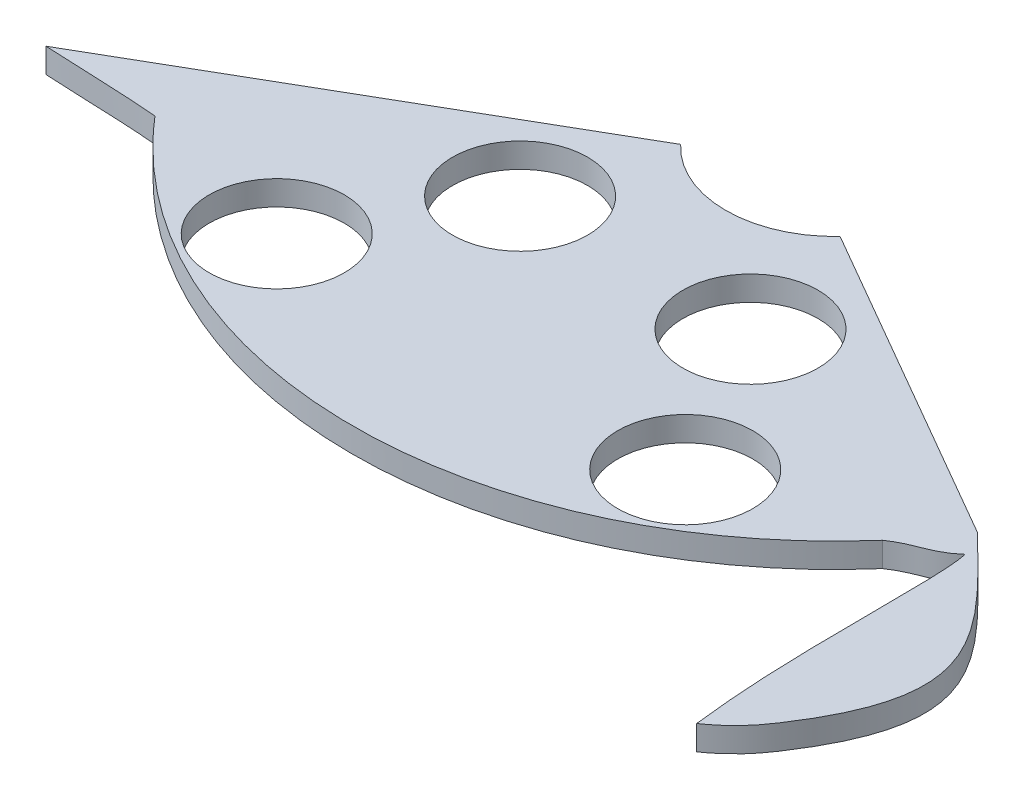
ISO-10303-21;
HEADER;
FILE_DESCRIPTION(('STEP AP214'),'2;1');
FILE_NAME('part.step','',(''),(''),'','','');
FILE_SCHEMA(('AUTOMOTIVE_DESIGN { 1 0 10303 214 1 1 1 1 }'));
ENDSEC;
DATA;
#1=APPLICATION_CONTEXT('core data for automotive mechanical design processes');
#2=APPLICATION_PROTOCOL_DEFINITION('international standard','automotive_design',2000,#1);
#3=PRODUCT_CONTEXT('',#1,'mechanical');
#4=PRODUCT('Part','Part','',(#3));
#5=PRODUCT_RELATED_PRODUCT_CATEGORY('part','',(#4));
#6=PRODUCT_DEFINITION_FORMATION('','',#4);
#7=PRODUCT_DEFINITION_CONTEXT('part definition',#1,'design');
#8=PRODUCT_DEFINITION('design','',#6,#7);
#9=PRODUCT_DEFINITION_SHAPE('','',#8);
#10=(LENGTH_UNIT() NAMED_UNIT(*) SI_UNIT(.MILLI.,.METRE.));
#11=(NAMED_UNIT(*) PLANE_ANGLE_UNIT() SI_UNIT($,.RADIAN.));
#12=(NAMED_UNIT(*) SI_UNIT($,.STERADIAN.) SOLID_ANGLE_UNIT());
#13=UNCERTAINTY_MEASURE_WITH_UNIT(LENGTH_MEASURE(1.E-05),#10,'distance_accuracy_value','');
#14=(GEOMETRIC_REPRESENTATION_CONTEXT(3) GLOBAL_UNCERTAINTY_ASSIGNED_CONTEXT((#13)) GLOBAL_UNIT_ASSIGNED_CONTEXT((#10,
#11,#12)) REPRESENTATION_CONTEXT('',''));
#15=CARTESIAN_POINT('',(0.,0.,0.));
#16=DIRECTION('',(0.,0.,1.));
#17=DIRECTION('',(1.,0.,0.));
#18=AXIS2_PLACEMENT_3D('',#15,#16,#17);
#19=CARTESIAN_POINT('',(-69.1124513875644,-23.7359999999999,50.3384617614446));
#20=DIRECTION('',(0.,-1.,0.));
#21=DIRECTION('',(0.,0.,-1.));
#22=AXIS2_PLACEMENT_3D('',#19,#20,#21);
#23=PLANE('',#22);
#24=CARTESIAN_POINT('',(18.75,-23.7359999999999,32.476));
#25=DIRECTION('',(0.,-1.,0.));
#26=DIRECTION('',(0.,0.,-1.));
#27=AXIS2_PLACEMENT_3D('',#24,#25,#26);
#28=CIRCLE('',#27,10.999845998306);
#29=CARTESIAN_POINT('',(18.75,-23.7359999999999,21.476154001694));
#30=VERTEX_POINT('',#29);
#31=EDGE_CURVE('E307',#30,#30,#28,.T.);
#32=ORIENTED_EDGE('',*,*,#31,.F.);
#33=EDGE_LOOP('',(#32));
#34=FACE_BOUND('',#33,.T.);
#35=CARTESIAN_POINT('',(-33.25,-23.7359999999999,57.591));
#36=DIRECTION('',(0.,-1.,0.));
#37=DIRECTION('',(0.,0.,-1.));
#38=AXIS2_PLACEMENT_3D('',#35,#36,#37);
#39=CIRCLE('',#38,10.999845998306);
#40=CARTESIAN_POINT('',(-33.25,-23.7359999999999,46.591154001694));
#41=VERTEX_POINT('',#40);
#42=EDGE_CURVE('E300',#41,#41,#39,.T.);
#43=ORIENTED_EDGE('',*,*,#42,.F.);
#44=EDGE_LOOP('',(#43));
#45=FACE_BOUND('',#44,.T.);
#46=DIRECTION('',(0.866023970222276,0.,-0.500002482994281));
#47=VECTOR('',#46,1.);
#48=CARTESIAN_POINT('',(-69.4473114993103,-23.7359999999999,44.7142801293079));
#49=LINE('',#48,#47);
#50=CARTESIAN_POINT('',(-78.47579260709,-23.7359999999999,49.9269106415998));
#51=VERTEX_POINT('',#50);
#52=CARTESIAN_POINT('',(-69.4473114993103,-23.7359999999999,44.7142801293079));
#53=VERTEX_POINT('',#52);
#54=EDGE_CURVE('E296',#51,#53,#49,.T.);
#55=ORIENTED_EDGE('',*,*,#54,.T.);
#56=DIRECTION('',(0.86602512227785,0.,-0.500000487583396));
#57=VECTOR('',#56,1.);
#58=CARTESIAN_POINT('',(-69.4473114993103,-23.7359999999999,44.7142801293079));
#59=LINE('',#58,#57);
#60=CARTESIAN_POINT('',(-12.9766531358799,-23.7359999999999,12.1108879302399));
#61=VERTEX_POINT('',#60);
#62=EDGE_CURVE('E103',#53,#61,#59,.T.);
#63=ORIENTED_EDGE('',*,*,#62,.T.);
#64=CARTESIAN_POINT('',(0.,-23.7359999999999,0.));
#65=DIRECTION('',(0.,1.,0.));
#66=DIRECTION('',(0.,0.,-1.));
#67=AXIS2_PLACEMENT_3D('',#64,#65,#66);
#68=CIRCLE('',#67,17.7501305084715);
#69=CARTESIAN_POINT('',(12.9766531358511,-23.7359999999999,12.1108879302707));
#70=VERTEX_POINT('',#69);
#71=EDGE_CURVE('E293',#61,#70,#68,.T.);
#72=ORIENTED_EDGE('',*,*,#71,.T.);
#73=DIRECTION('',(0.866025113442762,0.,0.500000502886197));
#74=VECTOR('',#73,1.);
#75=CARTESIAN_POINT('',(12.9766531358511,-23.7359999999999,12.1108879302707));
#76=LINE('',#75,#74);
#77=CARTESIAN_POINT('',(65.8946490574716,-23.7359999999999,42.6631480920527));
#78=VERTEX_POINT('',#77);
#79=EDGE_CURVE('E288',#70,#78,#76,.T.);
#80=ORIENTED_EDGE('',*,*,#79,.T.);
#81=CARTESIAN_POINT('',(65.8946490574716,-23.7359999999999,42.6631480920527));
#82=CARTESIAN_POINT('',(81.2383570122726,-23.7359999999999,57.6152141275644));
#83=CARTESIAN_POINT('',(89.9374263412387,-23.7359999999999,65.8113401457254));
#84=CARTESIAN_POINT('',(74.626877504248,-23.7359999999999,88.5732499283281));
#85=CARTESIAN_POINT('',(72.4788017296965,-23.7359999999999,90.705561356363));
#86=CARTESIAN_POINT('',(69.970809865271,-23.7359999999999,92.4555617462981));
#87=B_SPLINE_CURVE_WITH_KNOTS('',3,(#81,#82,#83,#84,#85,#86),.UNSPECIFIED.,.F.,.F.,(4,2,4),(0.,
0.885994229678114,1.),.UNSPECIFIED.);
#88=CARTESIAN_POINT('',(69.971019810658,-23.7359999999999,92.4554152513172));
#89=VERTEX_POINT('',#88);
#90=EDGE_CURVE('E283',#78,#89,#87,.T.);
#91=ORIENTED_EDGE('',*,*,#90,.T.);
#92=DIRECTION('',(-0.84335249542748,0.,-0.537360743315179));
#93=VECTOR('',#92,1.);
#94=CARTESIAN_POINT('',(69.9707649817314,-23.7359999999999,92.4552528814408));
#95=LINE('',#94,#93);
#96=CARTESIAN_POINT('',(69.9707649817314,-23.7359999999999,92.4552528814408));
#97=VERTEX_POINT('',#96);
#98=EDGE_CURVE('E258',#89,#97,#95,.T.);
#99=ORIENTED_EDGE('',*,*,#98,.T.);
#100=CARTESIAN_POINT('',(-2889.41980094783,-23.7359999999999,572.469086040441));
#101=CARTESIAN_POINT('',(105.702344872308,-23.7359999999999,179.877839322316));
#102=CARTESIAN_POINT('',(74.8237969195549,-23.7359999999999,136.705133132081));
#103=CARTESIAN_POINT('',(69.7082849499809,-23.7359999999999,90.1646779087191));
#104=CARTESIAN_POINT('',(69.5893485551669,-23.7359999999999,89.0097247497464));
#105=CARTESIAN_POINT('',(69.4662447817166,-23.7359999999999,87.7185245262436));
#106=CARTESIAN_POINT('',(69.3421874997841,-23.7359999999999,86.2855751027808));
#107=CARTESIAN_POINT('',(69.1816950778925,-23.7359999999999,84.1942609075338));
#108=CARTESIAN_POINT('',(69.0176943426748,-23.7359999999999,81.5747823025262));
#109=CARTESIAN_POINT('',(68.8711783345288,-23.7359999999999,78.4340251142055));
#110=CARTESIAN_POINT('',(68.7662663321478,-23.7359999999999,75.2921025514093));
#111=CARTESIAN_POINT('',(68.6953543992363,-23.7359999999999,72.1492209476432));
#112=CARTESIAN_POINT('',(68.6587659975122,-23.7359999999999,69.5295929177795));
#113=CARTESIAN_POINT('',(68.6395136480958,-23.7359999999999,67.4336031244953));
#114=CARTESIAN_POINT('',(68.6256689930921,-23.7359999999999,65.3373313324037));
#115=CARTESIAN_POINT('',(68.6159760750228,-23.7359999999999,62.7168322566729));
#116=CARTESIAN_POINT('',(68.6071524907781,-23.7359999999999,59.5721845079304));
#117=CARTESIAN_POINT('',(68.5872453880813,-23.7359999999999,56.3175287932184));
#118=CARTESIAN_POINT('',(68.5324754103714,-23.7359999999999,53.1733624795637));
#119=CARTESIAN_POINT('',(68.4243956192419,-23.7359999999999,50.4960324205136));
#120=CARTESIAN_POINT('',(68.2643458486834,-23.7359999999999,48.5159703860079));
#121=CARTESIAN_POINT('',(68.1151920994379,-23.7359999999999,47.429993991525));
#122=CARTESIAN_POINT('',(66.2345435118333,-23.7359999999999,38.0346110729094));
#123=CARTESIAN_POINT('',(49.4094438918094,-23.7359999999999,32.2710254197204));
#124=CARTESIAN_POINT('',(2996.93012963252,-23.7359999999999,-599.453968252049));
#125=B_SPLINE_CURVE_WITH_KNOTS('',3,(#100,#101,#102,#103,#104,#105,#106,#107,#108,#109,#110,
#111,#112,#113,#114,#115,#116,#117,#118,#119,#120,#121,#122,#123,#124),.UNSPECIFIED.,.F.,.F.,(4,
1,1,1,1,1,1,1,1,1,1,1,1,1,1,1,1,1,1,1,1,1,4),(-2.99202639558263,0.0250964299356211,
0.0503165586839259,0.075670735571427,0.101169667617065,0.135300022217013,0.169908490288202,
0.238595521242641,0.307257082878205,0.375910739420374,0.444566925589581,0.513230853089394,
0.547566274427719,0.581903795914694,0.650583383837448,0.719264669615281,0.787945334433598,
0.863832791596734,0.925301574305985,0.963466008638008,0.993970587991765,0.997031667194753,
1.59124072714442),.UNSPECIFIED.);
#126=CARTESIAN_POINT('',(67.9764891865245,-23.7359999999999,46.7489717344252));
#127=VERTEX_POINT('',#126);
#128=EDGE_CURVE('E130',#97,#127,#125,.T.);
#129=ORIENTED_EDGE('',*,*,#128,.T.);
#130=CARTESIAN_POINT('',(59.2566175154613,-23.7359999999999,51.4883510479614));
#131=CARTESIAN_POINT('',(59.339288682393,-23.7359999999999,51.4333500373283));
#132=CARTESIAN_POINT('',(59.493246096872,-23.7359999999999,51.3309223868538));
#133=CARTESIAN_POINT('',(59.8260544340864,-23.7359999999999,51.1167936445335));
#134=CARTESIAN_POINT('',(60.4380382819007,-23.7359999999999,50.7423475835651));
#135=CARTESIAN_POINT('',(61.3659919977051,-23.7359999999999,50.240814838771));
#136=CARTESIAN_POINT('',(62.3310151387279,-23.7359999999999,49.8138652505641));
#137=CARTESIAN_POINT('',(63.1161392674193,-23.7359999999999,49.5010369423988));
#138=CARTESIAN_POINT('',(63.9047594027139,-23.7359999999999,49.1940125770646));
#139=CARTESIAN_POINT('',(64.88433342496,-23.7359999999999,48.7924294230713));
#140=CARTESIAN_POINT('',(66.0112312914302,-23.7359999999999,48.2067784045567));
#141=CARTESIAN_POINT('',(66.8914356212669,-23.7359999999999,47.6208750943832));
#142=CARTESIAN_POINT('',(67.4598606302687,-23.7359999999999,47.1813375254096));
#143=CARTESIAN_POINT('',(67.7641375698428,-23.7359999999999,46.9311744200733));
#144=CARTESIAN_POINT('',(67.9030749855885,-23.7359999999999,46.8119634915297));
#145=CARTESIAN_POINT('',(67.9764891865245,-23.7359999999999,46.7489717344252));
#146=B_SPLINE_CURVE_WITH_KNOTS('',3,(#130,#131,#132,#133,#134,#135,#136,#137,#138,#139,#140,
#141,#142,#143,#144,#145),.UNSPECIFIED.,.F.,.F.,(4,1,1,1,1,1,1,1,1,1,1,1,1,4),
(2.02648239300274E-05,0.0298976653979479,0.0556605504815002,0.119093858258256,0.245746885974789,
0.372700188173254,0.436367897683126,0.500049535246441,0.627359850407847,0.754738943276122,
0.881481251617496,0.944915915432278,0.970893509235219,1.),.UNSPECIFIED.);
#147=CARTESIAN_POINT('',(59.2566175154613,-23.7359999999999,51.4883510479614));
#148=VERTEX_POINT('',#147);
#149=EDGE_CURVE('E122',#127,#148,#146,.F.);
#150=ORIENTED_EDGE('',*,*,#149,.T.);
#151=CARTESIAN_POINT('',(-59.7580439931396,-23.7359999999999,50.9043947309755));
#152=CARTESIAN_POINT('',(-56.1085356786347,-23.7359999999999,55.1878179909933));
#153=CARTESIAN_POINT('',(-51.9965130678112,-23.7359999999999,59.079244182804));
#154=CARTESIAN_POINT('',(-43.0367353472473,-23.7359999999999,65.8918838492414));
#155=CARTESIAN_POINT('',(-38.1902412030831,-23.7359999999999,68.8151171053031));
#156=CARTESIAN_POINT('',(-30.5335060335401,-23.7359999999999,72.3726977128505));
#157=CARTESIAN_POINT('',(-27.9172923271023,-23.7359999999999,73.4222982028232));
#158=CARTESIAN_POINT('',(-22.589804052345,-23.7359999999999,75.2324356127937));
#159=CARTESIAN_POINT('',(-19.87635954292,-23.7359999999999,75.9938792228486));
#160=CARTESIAN_POINT('',(-11.6370141574862,-23.7359999999999,77.8358416911965));
#161=CARTESIAN_POINT('',(-6.01288499495427,-23.7359999999999,78.4705308031694));
#162=CARTESIAN_POINT('',(2.42982032128352,-23.7359999999999,78.5123642591962));
#163=CARTESIAN_POINT('',(5.24419291821481,-23.7359999999999,78.3752200966692));
#164=CARTESIAN_POINT('',(10.841797825312,-23.7359999999999,77.7983882048732));
#165=CARTESIAN_POINT('',(13.6263400472149,-23.7359999999999,77.3591501447022));
#166=CARTESIAN_POINT('',(21.8825443356551,-23.7359999999999,75.5984983589059));
#167=CARTESIAN_POINT('',(27.2611481161396,-23.7359999999999,73.8302348943191));
#168=CARTESIAN_POINT('',(34.9487048248143,-23.7359999999999,70.3478342891043));
#169=CARTESIAN_POINT('',(37.4498498849557,-23.7359999999999,69.0472352757743));
#170=CARTESIAN_POINT('',(42.2995083689153,-23.7359999999999,66.1885654846745));
#171=CARTESIAN_POINT('',(44.6440490887984,-23.7359999999999,64.6302321879928));
#172=CARTESIAN_POINT('',(51.4147060036232,-23.7359999999999,59.5839253824527));
#173=CARTESIAN_POINT('',(55.5658468319752,-23.7359999999999,55.7360646124372));
#174=CARTESIAN_POINT('',(59.2566175154111,-23.7359999999999,51.488351047918));
#175=B_SPLINE_CURVE_WITH_KNOTS('',3,(#151,#152,#153,#154,#155,#156,#157,#158,#159,#160,#161,
#162,#163,#164,#165,#166,#167,#168,#169,#170,#171,#172,#173,#174),.UNSPECIFIED.,.F.,.F.,(4,2,2,
2,2,2,2,2,2,2,2,4),(1.47486505874816E-06,0.125001342094121,0.250001342094121,0.312501342094121,
0.375001342094121,0.500001342094121,0.562501342094121,0.625001342094121,0.750001342094122,
0.812501342094122,0.875001342094121,0.999999867229062),.UNSPECIFIED.);
#176=CARTESIAN_POINT('',(-59.7580439931396,-23.7359999999999,50.9043947309755));
#177=VERTEX_POINT('',#176);
#178=EDGE_CURVE('E127',#148,#177,#175,.F.);
#179=ORIENTED_EDGE('',*,*,#178,.T.);
#180=CARTESIAN_POINT('',(-78.47579260709,-23.7359999999999,49.9269106415998));
#181=CARTESIAN_POINT('',(-78.2902248339486,-23.7359999999999,49.939477201206));
#182=CARTESIAN_POINT('',(-77.911068988607,-23.7359999999999,49.9651534511814));
#183=CARTESIAN_POINT('',(-77.2494278149706,-23.7359999999999,50.0036437504071));
#184=CARTESIAN_POINT('',(-76.4567643674109,-23.7359999999999,50.0445889543566));
#185=CARTESIAN_POINT('',(-75.2587009438122,-23.7359999999999,50.100867628767));
#186=CARTESIAN_POINT('',(-73.7435992680446,-23.7359999999999,50.1630099875507));
#187=CARTESIAN_POINT('',(-71.3464015178812,-23.7359999999999,50.2511396316299));
#188=CARTESIAN_POINT('',(-68.3500826757227,-23.7359999999999,50.3652043776993));
#189=CARTESIAN_POINT('',(-65.2736563900656,-23.7359999999999,50.5061377122563));
#190=CARTESIAN_POINT('',(-62.8793786395344,-23.7359999999999,50.6486474931526));
#191=CARTESIAN_POINT('',(-61.4399050862019,-23.7359999999999,50.7539786659854));
#192=CARTESIAN_POINT('',(-60.4536452999027,-23.7359999999999,50.8376692829723));
#193=CARTESIAN_POINT('',(-59.9843057065386,-23.7359999999999,50.8826906110879));
#194=CARTESIAN_POINT('',(-59.7580439932218,-23.7359999999999,50.9043947310455));
#195=B_SPLINE_CURVE_WITH_KNOTS('',3,(#180,#181,#182,#183,#184,#185,#186,#187,#188,#189,#190,
#191,#192,#193,#194),.UNSPECIFIED.,.F.,.F.,(4,1,1,1,1,1,1,1,1,1,1,1,4),(0.,0.0297660022236176,
0.0608185006721552,0.106066225756997,0.156791878762026,0.252766464949282,0.348744086816081,
0.540696768832985,0.732642544383059,0.841595283747465,0.924542927268898,0.96362325531576,1.),.UNSPECIFIED.);
#196=EDGE_CURVE('E51',#177,#51,#195,.F.);
#197=ORIENTED_EDGE('',*,*,#196,.T.);
#198=EDGE_LOOP('',(#55,#63,#72,#80,#91,#99,#129,#150,#179,#197));
#199=FACE_BOUND('',#198,.T.);
#200=CARTESIAN_POINT('',(33.25,-23.7359999999999,57.591));
#201=DIRECTION('',(0.,-1.,0.));
#202=DIRECTION('',(0.,0.,-1.));
#203=AXIS2_PLACEMENT_3D('',#200,#201,#202);
#204=CIRCLE('',#203,10.999845998306);
#205=CARTESIAN_POINT('',(33.25,-23.7359999999999,46.591154001694));
#206=VERTEX_POINT('',#205);
#207=EDGE_CURVE('E301',#206,#206,#204,.T.);
#208=ORIENTED_EDGE('',*,*,#207,.F.);
#209=EDGE_LOOP('',(#208));
#210=FACE_BOUND('',#209,.T.);
#211=CARTESIAN_POINT('',(-18.75,-23.7359999999999,32.476));
#212=DIRECTION('',(0.,-1.,0.));
#213=DIRECTION('',(0.,0.,-1.));
#214=AXIS2_PLACEMENT_3D('',#211,#212,#213);
#215=CIRCLE('',#214,10.999845998306);
#216=CARTESIAN_POINT('',(-18.75,-23.7359999999999,21.476154001694));
#217=VERTEX_POINT('',#216);
#218=EDGE_CURVE('E313',#217,#217,#215,.T.);
#219=ORIENTED_EDGE('',*,*,#218,.F.);
#220=EDGE_LOOP('',(#219));
#221=FACE_BOUND('',#220,.T.);
#222=ADVANCED_FACE('F30',(#34,#45,#199,#210,#221),#23,.T.);
#223=CARTESIAN_POINT('',(-69.1124513875644,-19.7359999999999,50.3384617614446));
#224=DIRECTION('',(0.,-1.,0.));
#225=DIRECTION('',(0.,0.,-1.));
#226=AXIS2_PLACEMENT_3D('',#223,#224,#225);
#227=PLANE('',#226);
#228=CARTESIAN_POINT('',(18.75,-19.7359999999999,32.476));
#229=DIRECTION('',(0.,-1.,0.));
#230=DIRECTION('',(0.,0.,-1.));
#231=AXIS2_PLACEMENT_3D('',#228,#229,#230);
#232=CIRCLE('',#231,10.999845998306);
#233=CARTESIAN_POINT('',(18.75,-19.7359999999999,21.476154001694));
#234=VERTEX_POINT('',#233);
#235=EDGE_CURVE('E310',#234,#234,#232,.T.);
#236=ORIENTED_EDGE('',*,*,#235,.T.);
#237=EDGE_LOOP('',(#236));
#238=FACE_BOUND('',#237,.T.);
#239=CARTESIAN_POINT('',(-33.25,-19.7359999999999,57.591));
#240=DIRECTION('',(0.,-1.,0.));
#241=DIRECTION('',(0.,0.,-1.));
#242=AXIS2_PLACEMENT_3D('',#239,#240,#241);
#243=CIRCLE('',#242,10.999845998306);
#244=CARTESIAN_POINT('',(-33.25,-19.7359999999999,46.591154001694));
#245=VERTEX_POINT('',#244);
#246=EDGE_CURVE('E297',#245,#245,#243,.T.);
#247=ORIENTED_EDGE('',*,*,#246,.T.);
#248=EDGE_LOOP('',(#247));
#249=FACE_BOUND('',#248,.T.);
#250=DIRECTION('',(0.866023970222276,0.,-0.500002482994281));
#251=VECTOR('',#250,1.);
#252=CARTESIAN_POINT('',(-69.4473114993103,-19.7359999999999,44.7142801293079));
#253=LINE('',#252,#251);
#254=CARTESIAN_POINT('',(-78.47579260709,-19.7359999999999,49.9269106415998));
#255=VERTEX_POINT('',#254);
#256=CARTESIAN_POINT('',(-69.4473114993103,-19.7359999999999,44.7142801293079));
#257=VERTEX_POINT('',#256);
#258=EDGE_CURVE('E194',#255,#257,#253,.T.);
#259=ORIENTED_EDGE('',*,*,#258,.F.);
#260=CARTESIAN_POINT('',(-59.7580439932218,-19.7359999999999,50.9043947310455));
#261=CARTESIAN_POINT('',(-59.9843057065386,-19.7359999999999,50.8826906110879));
#262=CARTESIAN_POINT('',(-60.4536452999027,-19.7359999999999,50.8376692829723));
#263=CARTESIAN_POINT('',(-61.4399050862019,-19.7359999999999,50.7539786659854));
#264=CARTESIAN_POINT('',(-62.8793786395344,-19.7359999999999,50.6486474931526));
#265=CARTESIAN_POINT('',(-65.2736563900656,-19.7359999999999,50.5061377122563));
#266=CARTESIAN_POINT('',(-68.3500826757227,-19.7359999999999,50.3652043776993));
#267=CARTESIAN_POINT('',(-71.3464015178812,-19.7359999999999,50.2511396316299));
#268=CARTESIAN_POINT('',(-73.7435992680446,-19.7359999999999,50.1630099875507));
#269=CARTESIAN_POINT('',(-75.2587009438122,-19.7359999999999,50.100867628767));
#270=CARTESIAN_POINT('',(-76.4567643674109,-19.7359999999999,50.0445889543566));
#271=CARTESIAN_POINT('',(-77.2494278149706,-19.7359999999999,50.0036437504071));
#272=CARTESIAN_POINT('',(-77.911068988607,-19.7359999999999,49.9651534511814));
#273=CARTESIAN_POINT('',(-78.2902248339486,-19.7359999999999,49.939477201206));
#274=CARTESIAN_POINT('',(-78.47579260709,-19.7359999999999,49.9269106415998));
#275=B_SPLINE_CURVE_WITH_KNOTS('',3,(#260,#261,#262,#263,#264,#265,#266,#267,#268,#269,#270,
#271,#272,#273,#274),.UNSPECIFIED.,.F.,.F.,(4,1,1,1,1,1,1,1,1,1,1,1,4),(0.,0.0363767446842402,
0.0754570727311023,0.158404716252535,0.267357455616941,0.459303231167015,0.651255913183919,
0.747233535050718,0.843208121237974,0.893933774243003,0.939181499327845,0.970233997776382,1.),.UNSPECIFIED.);
#276=CARTESIAN_POINT('',(-59.7580439931396,-19.7359999999999,50.9043947309755));
#277=VERTEX_POINT('',#276);
#278=EDGE_CURVE('E94',#277,#255,#275,.T.);
#279=ORIENTED_EDGE('',*,*,#278,.F.);
#280=CARTESIAN_POINT('',(59.2566175154111,-19.7359999999999,51.488351047918));
#281=CARTESIAN_POINT('',(55.5658468319752,-19.7359999999999,55.7360646124372));
#282=CARTESIAN_POINT('',(51.4147060036232,-19.7359999999999,59.5839253824527));
#283=CARTESIAN_POINT('',(44.6440490887984,-19.7359999999999,64.6302321879928));
#284=CARTESIAN_POINT('',(42.2995083689153,-19.7359999999999,66.1885654846745));
#285=CARTESIAN_POINT('',(37.4498498849557,-19.7359999999999,69.0472352757743));
#286=CARTESIAN_POINT('',(34.9487048248143,-19.7359999999999,70.3478342891043));
#287=CARTESIAN_POINT('',(27.2611481161396,-19.7359999999999,73.8302348943191));
#288=CARTESIAN_POINT('',(21.8825443356551,-19.7359999999999,75.5984983589059));
#289=CARTESIAN_POINT('',(13.6263400472149,-19.7359999999999,77.3591501447022));
#290=CARTESIAN_POINT('',(10.841797825312,-19.7359999999999,77.7983882048732));
#291=CARTESIAN_POINT('',(5.24419291821481,-19.7359999999999,78.3752200966692));
#292=CARTESIAN_POINT('',(2.42982032128352,-19.7359999999999,78.5123642591962));
#293=CARTESIAN_POINT('',(-6.01288499495427,-19.7359999999999,78.4705308031694));
#294=CARTESIAN_POINT('',(-11.6370141574862,-19.7359999999999,77.8358416911965));
#295=CARTESIAN_POINT('',(-19.87635954292,-19.7359999999999,75.9938792228486));
#296=CARTESIAN_POINT('',(-22.589804052345,-19.7359999999999,75.2324356127937));
#297=CARTESIAN_POINT('',(-27.9172923271023,-19.7359999999999,73.4222982028232));
#298=CARTESIAN_POINT('',(-30.5335060335401,-19.7359999999999,72.3726977128505));
#299=CARTESIAN_POINT('',(-38.1902412030831,-19.7359999999999,68.8151171053031));
#300=CARTESIAN_POINT('',(-43.0367353472473,-19.7359999999999,65.8918838492414));
#301=CARTESIAN_POINT('',(-51.9965130678112,-19.7359999999999,59.079244182804));
#302=CARTESIAN_POINT('',(-56.1085356786347,-19.7359999999999,55.1878179909933));
#303=CARTESIAN_POINT('',(-59.7580439931396,-19.7359999999999,50.9043947309755));
#304=B_SPLINE_CURVE_WITH_KNOTS('',3,(#280,#281,#282,#283,#284,#285,#286,#287,#288,#289,#290,
#291,#292,#293,#294,#295,#296,#297,#298,#299,#300,#301,#302,#303),.UNSPECIFIED.,.F.,.F.,(4,2,2,
2,2,2,2,2,2,2,2,4),(1.47486505866833E-06,0.125,0.187499999999999,0.249999999999999,0.375,0.4375,
0.5,0.625,0.6875,0.75,0.875,0.999999867229062),.UNSPECIFIED.);
#305=CARTESIAN_POINT('',(59.2566175154613,-19.7359999999999,51.4883510479614));
#306=VERTEX_POINT('',#305);
#307=EDGE_CURVE('E87',#306,#277,#304,.T.);
#308=ORIENTED_EDGE('',*,*,#307,.F.);
#309=CARTESIAN_POINT('',(67.9764891865245,-19.736,46.7489717344252));
#310=CARTESIAN_POINT('',(67.9030749855885,-19.736,46.8119634915297));
#311=CARTESIAN_POINT('',(67.7641375698428,-19.736,46.9311744200733));
#312=CARTESIAN_POINT('',(67.4598606302687,-19.736,47.1813375254096));
#313=CARTESIAN_POINT('',(66.8914356212669,-19.736,47.6208750943832));
#314=CARTESIAN_POINT('',(66.0112312914302,-19.736,48.2067784045567));
#315=CARTESIAN_POINT('',(64.88433342496,-19.736,48.7924294230713));
#316=CARTESIAN_POINT('',(63.9047594027139,-19.736,49.1940125770646));
#317=CARTESIAN_POINT('',(63.1161392674193,-19.736,49.5010369423988));
#318=CARTESIAN_POINT('',(62.3310151387279,-19.736,49.8138652505641));
#319=CARTESIAN_POINT('',(61.3659919977051,-19.736,50.240814838771));
#320=CARTESIAN_POINT('',(60.4380382819007,-19.736,50.7423475835651));
#321=CARTESIAN_POINT('',(59.8260544340864,-19.736,51.1167936445335));
#322=CARTESIAN_POINT('',(59.493246096872,-19.736,51.3309223868538));
#323=CARTESIAN_POINT('',(59.339288682393,-19.736,51.4333500373283));
#324=CARTESIAN_POINT('',(59.2566175154613,-19.736,51.4883510479614));
#325=B_SPLINE_CURVE_WITH_KNOTS('',3,(#309,#310,#311,#312,#313,#314,#315,#316,#317,#318,#319,
#320,#321,#322,#323,#324),.UNSPECIFIED.,.F.,.F.,(4,1,1,1,1,1,1,1,1,1,1,1,1,4),
(2.02648239300835E-05,0.0291267555887115,0.0551043493916521,0.118539013206434,0.245281321547808,
0.372660414416083,0.499970729577489,0.563652367140804,0.627320076650676,0.754273378849141,
0.880926406565674,0.94435971434243,0.970122599425982,1.),.UNSPECIFIED.);
#326=CARTESIAN_POINT('',(67.9764891865245,-19.7359999999999,46.7489717344252));
#327=VERTEX_POINT('',#326);
#328=EDGE_CURVE('E140',#327,#306,#325,.T.);
#329=ORIENTED_EDGE('',*,*,#328,.F.);
#330=CARTESIAN_POINT('',(-2889.41980094783,-19.7359999999999,572.469086040441));
#331=CARTESIAN_POINT('',(105.702344872308,-19.7359999999999,179.877839322316));
#332=CARTESIAN_POINT('',(74.8237969195549,-19.7359999999999,136.705133132081));
#333=CARTESIAN_POINT('',(69.7082849499809,-19.7359999999999,90.1646779087191));
#334=CARTESIAN_POINT('',(69.5893485551669,-19.7359999999999,89.0097247497464));
#335=CARTESIAN_POINT('',(69.4662447817166,-19.7359999999999,87.7185245262436));
#336=CARTESIAN_POINT('',(69.3421874997841,-19.7359999999999,86.2855751027808));
#337=CARTESIAN_POINT('',(69.1816950778925,-19.7359999999999,84.1942609075338));
#338=CARTESIAN_POINT('',(69.0176943426748,-19.7359999999999,81.5747823025262));
#339=CARTESIAN_POINT('',(68.8711783345288,-19.7359999999999,78.4340251142055));
#340=CARTESIAN_POINT('',(68.7662663321478,-19.7359999999999,75.2921025514093));
#341=CARTESIAN_POINT('',(68.6953543992363,-19.7359999999999,72.1492209476432));
#342=CARTESIAN_POINT('',(68.6587659975122,-19.7359999999999,69.5295929177795));
#343=CARTESIAN_POINT('',(68.6395136480958,-19.7359999999999,67.4336031244953));
#344=CARTESIAN_POINT('',(68.6256689930921,-19.7359999999999,65.3373313324037));
#345=CARTESIAN_POINT('',(68.6159760750228,-19.7359999999999,62.7168322566729));
#346=CARTESIAN_POINT('',(68.6071524907781,-19.7359999999999,59.5721845079304));
#347=CARTESIAN_POINT('',(68.5872453880813,-19.7359999999999,56.3175287932184));
#348=CARTESIAN_POINT('',(68.5324754103714,-19.7359999999999,53.1733624795637));
#349=CARTESIAN_POINT('',(68.4243956192419,-19.7359999999999,50.4960324205136));
#350=CARTESIAN_POINT('',(68.2643458486834,-19.7359999999999,48.5159703860079));
#351=CARTESIAN_POINT('',(68.1151920994379,-19.7359999999999,47.429993991525));
#352=CARTESIAN_POINT('',(66.2345435118333,-19.7359999999999,38.0346110729094));
#353=CARTESIAN_POINT('',(49.4094438918094,-19.7359999999999,32.2710254197204));
#354=CARTESIAN_POINT('',(2996.93012963252,-19.7359999999999,-599.453968252049));
#355=B_SPLINE_CURVE_WITH_KNOTS('',3,(#330,#331,#332,#333,#334,#335,#336,#337,#338,#339,#340,
#341,#342,#343,#344,#345,#346,#347,#348,#349,#350,#351,#352,#353,#354),.UNSPECIFIED.,.F.,.F.,(4,
1,1,1,1,1,1,1,1,1,1,1,1,1,1,1,1,1,1,1,1,1,4),(-2.99202639558263,0.0250964299356211,
0.0503165586839259,0.075670735571427,0.101169667617065,0.135300022217013,0.169908490288202,
0.238595521242641,0.307257082878205,0.375910739420374,0.444566925589581,0.513230853089394,
0.547566274427719,0.581903795914694,0.650583383837448,0.719264669615281,0.787945334433598,
0.863832791596734,0.925301574305985,0.963466008638008,0.993970587991765,0.997031667194753,
1.59124072714442),.UNSPECIFIED.);
#356=CARTESIAN_POINT('',(69.9707649817314,-19.7359999999999,92.4552528814408));
#357=VERTEX_POINT('',#356);
#358=EDGE_CURVE('E207',#357,#327,#355,.T.);
#359=ORIENTED_EDGE('',*,*,#358,.F.);
#360=DIRECTION('',(-0.84335249542748,0.,-0.537360743315179));
#361=VECTOR('',#360,1.);
#362=CARTESIAN_POINT('',(69.9707649817314,-19.7359999999999,92.4552528814408));
#363=LINE('',#362,#361);
#364=CARTESIAN_POINT('',(69.971019810658,-19.7359999999999,92.4554152513172));
#365=VERTEX_POINT('',#364);
#366=EDGE_CURVE('E202',#365,#357,#363,.T.);
#367=ORIENTED_EDGE('',*,*,#366,.F.);
#368=CARTESIAN_POINT('',(65.8946490574716,-19.7359999999999,42.6631480920527));
#369=CARTESIAN_POINT('',(81.2383570122726,-19.7359999999999,57.6152141275644));
#370=CARTESIAN_POINT('',(89.9374263412387,-19.7359999999999,65.8113401457254));
#371=CARTESIAN_POINT('',(74.626877504248,-19.7359999999999,88.5732499283281));
#372=CARTESIAN_POINT('',(72.4788017296965,-19.7359999999999,90.705561356363));
#373=CARTESIAN_POINT('',(69.970809865271,-19.7359999999999,92.4555617462981));
#374=B_SPLINE_CURVE_WITH_KNOTS('',3,(#368,#369,#370,#371,#372,#373),.UNSPECIFIED.,.F.,.F.,(4,2,
4),(0.,0.885994229678114,1.),.UNSPECIFIED.);
#375=CARTESIAN_POINT('',(65.8946490574716,-19.7359999999999,42.6631480920527));
#376=VERTEX_POINT('',#375);
#377=EDGE_CURVE('E198',#376,#365,#374,.T.);
#378=ORIENTED_EDGE('',*,*,#377,.F.);
#379=DIRECTION('',(0.866025113442762,0.,0.500000502886197));
#380=VECTOR('',#379,1.);
#381=CARTESIAN_POINT('',(12.9766531358511,-19.7359999999999,12.1108879302707));
#382=LINE('',#381,#380);
#383=CARTESIAN_POINT('',(12.9766531358511,-19.7359999999999,12.1108879302707));
#384=VERTEX_POINT('',#383);
#385=EDGE_CURVE('E196',#384,#376,#382,.T.);
#386=ORIENTED_EDGE('',*,*,#385,.F.);
#387=CARTESIAN_POINT('',(0.,-19.7359999999999,0.));
#388=DIRECTION('',(0.,1.,0.));
#389=DIRECTION('',(0.,0.,-1.));
#390=AXIS2_PLACEMENT_3D('',#387,#388,#389);
#391=CIRCLE('',#390,17.7501305084715);
#392=CARTESIAN_POINT('',(-12.9766531358799,-19.7359999999999,12.1108879302399));
#393=VERTEX_POINT('',#392);
#394=EDGE_CURVE('E193',#393,#384,#391,.T.);
#395=ORIENTED_EDGE('',*,*,#394,.F.);
#396=DIRECTION('',(0.86602512227785,0.,-0.500000487583396));
#397=VECTOR('',#396,1.);
#398=CARTESIAN_POINT('',(-69.4473114993103,-19.7359999999999,44.7142801293079));
#399=LINE('',#398,#397);
#400=EDGE_CURVE('E188',#257,#393,#399,.T.);
#401=ORIENTED_EDGE('',*,*,#400,.F.);
#402=EDGE_LOOP('',(#259,#279,#308,#329,#359,#367,#378,#386,#395,#401));
#403=FACE_BOUND('',#402,.T.);
#404=CARTESIAN_POINT('',(33.25,-19.7359999999999,57.591));
#405=DIRECTION('',(0.,-1.,0.));
#406=DIRECTION('',(0.,0.,-1.));
#407=AXIS2_PLACEMENT_3D('',#404,#405,#406);
#408=CIRCLE('',#407,10.999845998306);
#409=CARTESIAN_POINT('',(33.25,-19.7359999999999,46.591154001694));
#410=VERTEX_POINT('',#409);
#411=EDGE_CURVE('E304',#410,#410,#408,.T.);
#412=ORIENTED_EDGE('',*,*,#411,.T.);
#413=EDGE_LOOP('',(#412));
#414=FACE_BOUND('',#413,.T.);
#415=CARTESIAN_POINT('',(-18.75,-19.7359999999999,32.476));
#416=DIRECTION('',(0.,-1.,0.));
#417=DIRECTION('',(0.,0.,-1.));
#418=AXIS2_PLACEMENT_3D('',#415,#416,#417);
#419=CIRCLE('',#418,10.999845998306);
#420=CARTESIAN_POINT('',(-18.75,-19.7359999999999,21.476154001694));
#421=VERTEX_POINT('',#420);
#422=EDGE_CURVE('E316',#421,#421,#419,.T.);
#423=ORIENTED_EDGE('',*,*,#422,.T.);
#424=EDGE_LOOP('',(#423));
#425=FACE_BOUND('',#424,.T.);
#426=ADVANCED_FACE('F234',(#238,#249,#403,#414,#425),#227,.F.);
#427=CARTESIAN_POINT('',(-69.4473114993103,-23.7359999999999,44.7142801293079));
#428=DIRECTION('',(0.500002482994281,0.,0.866023970222276));
#429=DIRECTION('',(0.866023970222277,0.,-0.500002482994281));
#430=AXIS2_PLACEMENT_3D('',#427,#428,#429);
#431=PLANE('',#430);
#432=ORIENTED_EDGE('',*,*,#258,.T.);
#433=DIRECTION('',(0.,1.,0.));
#434=VECTOR('',#433,1.);
#435=CARTESIAN_POINT('',(-69.4473114993103,-23.7359999999999,44.7142801293079));
#436=LINE('',#435,#434);
#437=EDGE_CURVE('E11',#53,#257,#436,.T.);
#438=ORIENTED_EDGE('',*,*,#437,.F.);
#439=ORIENTED_EDGE('',*,*,#54,.F.);
#440=DIRECTION('',(0.,1.,0.));
#441=VECTOR('',#440,1.);
#442=CARTESIAN_POINT('',(-78.47579260709,-23.7359999999999,49.9269106415998));
#443=LINE('',#442,#441);
#444=EDGE_CURVE('E475',#51,#255,#443,.T.);
#445=ORIENTED_EDGE('',*,*,#444,.T.);
#446=EDGE_LOOP('',(#432,#438,#439,#445));
#447=FACE_BOUND('',#446,.T.);
#448=ADVANCED_FACE('F32',(#447),#431,.F.);
#449=CARTESIAN_POINT('',(-69.4473114993103,-23.7359999999999,44.7142801293079));
#450=DIRECTION('',(0.500000487583397,0.,0.866025122277851));
#451=DIRECTION('',(0.866025122277851,0.,-0.500000487583397));
#452=AXIS2_PLACEMENT_3D('',#449,#450,#451);
#453=PLANE('',#452);
#454=ORIENTED_EDGE('',*,*,#400,.T.);
#455=DIRECTION('',(0.,1.,0.));
#456=VECTOR('',#455,1.);
#457=CARTESIAN_POINT('',(-12.9766531358799,-23.7359999999999,12.1108879302399));
#458=LINE('',#457,#456);
#459=EDGE_CURVE('E42',#61,#393,#458,.T.);
#460=ORIENTED_EDGE('',*,*,#459,.F.);
#461=ORIENTED_EDGE('',*,*,#62,.F.);
#462=ORIENTED_EDGE('',*,*,#437,.T.);
#463=EDGE_LOOP('',(#454,#460,#461,#462));
#464=FACE_BOUND('',#463,.T.);
#465=ADVANCED_FACE('F335',(#464),#453,.F.);
#466=CARTESIAN_POINT('',(0.,-23.7359999999999,0.));
#467=DIRECTION('',(0.,1.,0.));
#468=DIRECTION('',(0.,0.,1.));
#469=AXIS2_PLACEMENT_3D('',#466,#467,#468);
#470=CYLINDRICAL_SURFACE('',#469,17.7501305084715);
#471=ORIENTED_EDGE('',*,*,#394,.T.);
#472=DIRECTION('',(0.,1.,0.));
#473=VECTOR('',#472,1.);
#474=CARTESIAN_POINT('',(12.9766531358511,-23.7359999999999,12.1108879302707));
#475=LINE('',#474,#473);
#476=EDGE_CURVE('E217',#70,#384,#475,.T.);
#477=ORIENTED_EDGE('',*,*,#476,.F.);
#478=ORIENTED_EDGE('',*,*,#71,.F.);
#479=ORIENTED_EDGE('',*,*,#459,.T.);
#480=EDGE_LOOP('',(#471,#477,#478,#479));
#481=FACE_BOUND('',#480,.T.);
#482=ADVANCED_FACE('F398',(#481),#470,.F.);
#483=CARTESIAN_POINT('',(12.9766531358511,-23.7359999999999,12.1108879302707));
#484=DIRECTION('',(-0.500000502886198,0.,0.866025113442763));
#485=DIRECTION('',(0.866025113442762,0.,0.500000502886197));
#486=AXIS2_PLACEMENT_3D('',#483,#484,#485);
#487=PLANE('',#486);
#488=ORIENTED_EDGE('',*,*,#385,.T.);
#489=DIRECTION('',(0.,1.,0.));
#490=VECTOR('',#489,1.);
#491=CARTESIAN_POINT('',(65.8946490574716,-23.7359999999999,42.6631480920527));
#492=LINE('',#491,#490);
#493=EDGE_CURVE('E214',#78,#376,#492,.T.);
#494=ORIENTED_EDGE('',*,*,#493,.F.);
#495=ORIENTED_EDGE('',*,*,#79,.F.);
#496=ORIENTED_EDGE('',*,*,#476,.T.);
#497=EDGE_LOOP('',(#488,#494,#495,#496));
#498=FACE_BOUND('',#497,.T.);
#499=ADVANCED_FACE('F280',(#498),#487,.F.);
#500=DIRECTION('',(0.,1.,0.));
#501=VECTOR('',#500,1.);
#502=SURFACE_OF_LINEAR_EXTRUSION('',#87,#501);
#503=ORIENTED_EDGE('',*,*,#377,.T.);
#504=DIRECTION('',(0.,1.,0.));
#505=VECTOR('',#504,1.);
#506=CARTESIAN_POINT('',(69.971019810658,-23.7359999999999,92.4554152513172));
#507=LINE('',#506,#505);
#508=EDGE_CURVE('E211',#89,#365,#507,.T.);
#509=ORIENTED_EDGE('',*,*,#508,.F.);
#510=ORIENTED_EDGE('',*,*,#90,.F.);
#511=ORIENTED_EDGE('',*,*,#493,.T.);
#512=EDGE_LOOP('',(#503,#509,#510,#511));
#513=FACE_BOUND('',#512,.T.);
#514=ADVANCED_FACE('F276',(#513),#502,.F.);
#515=CARTESIAN_POINT('',(69.9707649817314,-23.7359999999999,92.4552528814408));
#516=DIRECTION('',(0.537360743315179,0.,-0.84335249542748));
#517=DIRECTION('',(-0.84335249542748,0.,-0.537360743315179));
#518=AXIS2_PLACEMENT_3D('',#515,#516,#517);
#519=PLANE('',#518);
#520=ORIENTED_EDGE('',*,*,#366,.T.);
#521=DIRECTION('',(0.,1.,0.));
#522=VECTOR('',#521,1.);
#523=CARTESIAN_POINT('',(69.9707649817314,-23.7359999999999,92.4552528814408));
#524=LINE('',#523,#522);
#525=EDGE_CURVE('E208',#97,#357,#524,.T.);
#526=ORIENTED_EDGE('',*,*,#525,.F.);
#527=ORIENTED_EDGE('',*,*,#98,.F.);
#528=ORIENTED_EDGE('',*,*,#508,.T.);
#529=EDGE_LOOP('',(#520,#526,#527,#528));
#530=FACE_BOUND('',#529,.T.);
#531=ADVANCED_FACE('F272',(#530),#519,.F.);
#532=DIRECTION('',(0.,1.,0.));
#533=VECTOR('',#532,1.);
#534=SURFACE_OF_LINEAR_EXTRUSION('',#125,#533);
#535=ORIENTED_EDGE('',*,*,#358,.T.);
#536=DIRECTION('',(0.,1.,0.));
#537=VECTOR('',#536,1.);
#538=CARTESIAN_POINT('',(67.9764891865245,-23.7359999999999,46.7489717344252));
#539=LINE('',#538,#537);
#540=EDGE_CURVE('E142',#127,#327,#539,.T.);
#541=ORIENTED_EDGE('',*,*,#540,.F.);
#542=ORIENTED_EDGE('',*,*,#128,.F.);
#543=ORIENTED_EDGE('',*,*,#525,.T.);
#544=EDGE_LOOP('',(#535,#541,#542,#543));
#545=FACE_BOUND('',#544,.T.);
#546=ADVANCED_FACE('F269',(#545),#534,.F.);
#547=CARTESIAN_POINT('',(67.9766425261212,-23.7359999999999,46.7488401640945));
#548=CARTESIAN_POINT('',(67.903177212322,-23.7359999999999,46.8118757783739));
#549=CARTESIAN_POINT('',(67.7641895963676,-23.7359999999999,46.9311316461548));
#550=CARTESIAN_POINT('',(67.4598606302687,-23.7359999999999,47.1813375254096));
#551=CARTESIAN_POINT('',(66.8914356212669,-23.7359999999999,47.6208750943832));
#552=CARTESIAN_POINT('',(66.0112312914302,-23.7359999999999,48.2067784045567));
#553=CARTESIAN_POINT('',(64.88433342496,-23.7359999999999,48.7924294230713));
#554=CARTESIAN_POINT('',(63.9047594027139,-23.7359999999999,49.1940125770646));
#555=CARTESIAN_POINT('',(63.1161392674193,-23.7359999999999,49.5010369423988));
#556=CARTESIAN_POINT('',(62.3310151387279,-23.7359999999999,49.8138652505641));
#557=CARTESIAN_POINT('',(61.3659919977051,-23.7359999999999,50.240814838771));
#558=CARTESIAN_POINT('',(60.4380382819007,-23.7359999999999,50.7423475835651));
#559=CARTESIAN_POINT('',(59.8260544340864,-23.7359999999999,51.1167936445335));
#560=CARTESIAN_POINT('',(59.493246096872,-23.7359999999999,51.3309223868538));
#561=CARTESIAN_POINT('',(59.339288682393,-23.7359999999999,51.4333500373283));
#562=CARTESIAN_POINT('',(59.2566175154613,-23.7359999999999,51.4883510479614));
#563=B_SPLINE_CURVE_WITH_KNOTS('',3,(#547,#548,#549,#550,#551,#552,#553,#554,#555,#556,#557,
#558,#559,#560,#561,#562),.UNSPECIFIED.,.F.,.F.,(4,1,1,1,1,1,1,1,1,1,1,1,1,4),(0.,
0.0291267555887115,0.0551043493916521,0.118539013206434,0.245281321547808,0.372660414416083,
0.499970729577489,0.563652367140804,0.627320076650676,0.754273378849141,0.880926406565674,
0.94435971434243,0.970122599425982,1.),.UNSPECIFIED.);
#564=DIRECTION('',(0.,1.,0.));
#565=VECTOR('',#564,1.);
#566=SURFACE_OF_LINEAR_EXTRUSION('',#563,#565);
#567=ORIENTED_EDGE('',*,*,#328,.T.);
#568=DIRECTION('',(0.,1.,0.));
#569=VECTOR('',#568,1.);
#570=CARTESIAN_POINT('',(59.2566175154613,-23.7359999999999,51.4883510479614));
#571=LINE('',#570,#569);
#572=EDGE_CURVE('E137',#148,#306,#571,.T.);
#573=ORIENTED_EDGE('',*,*,#572,.F.);
#574=ORIENTED_EDGE('',*,*,#149,.F.);
#575=ORIENTED_EDGE('',*,*,#540,.T.);
#576=EDGE_LOOP('',(#567,#573,#574,#575));
#577=FACE_BOUND('',#576,.T.);
#578=ADVANCED_FACE('F138',(#577),#566,.F.);
#579=CARTESIAN_POINT('',(59.2567481580895,-23.7359999999999,51.4882006906734));
#580=CARTESIAN_POINT('',(55.5659447910415,-23.7359999999999,55.735973810092));
#581=CARTESIAN_POINT('',(51.4147592616704,-23.7359999999999,59.5838856881587));
#582=CARTESIAN_POINT('',(44.6440490887984,-23.7359999999999,64.6302321879928));
#583=CARTESIAN_POINT('',(42.2995083689153,-23.7359999999999,66.1885654846745));
#584=CARTESIAN_POINT('',(37.4498498849557,-23.7359999999999,69.0472352757743));
#585=CARTESIAN_POINT('',(34.9487048248143,-23.7359999999999,70.3478342891043));
#586=CARTESIAN_POINT('',(27.2611481161396,-23.7359999999999,73.8302348943191));
#587=CARTESIAN_POINT('',(21.8825443356551,-23.7359999999999,75.5984983589059));
#588=CARTESIAN_POINT('',(13.6263400472149,-23.7359999999999,77.3591501447022));
#589=CARTESIAN_POINT('',(10.841797825312,-23.7359999999999,77.7983882048732));
#590=CARTESIAN_POINT('',(5.24419291821481,-23.7359999999999,78.3752200966692));
#591=CARTESIAN_POINT('',(2.42982032128352,-23.7359999999999,78.5123642591962));
#592=CARTESIAN_POINT('',(-6.01288499495427,-23.7359999999999,78.4705308031694));
#593=CARTESIAN_POINT('',(-11.6370141574862,-23.7359999999999,77.8358416911965));
#594=CARTESIAN_POINT('',(-19.87635954292,-23.7359999999999,75.9938792228486));
#595=CARTESIAN_POINT('',(-22.589804052345,-23.7359999999999,75.2324356127937));
#596=CARTESIAN_POINT('',(-27.9172923271023,-23.7359999999999,73.4222982028232));
#597=CARTESIAN_POINT('',(-30.5335060335401,-23.7359999999999,72.3726977128505));
#598=CARTESIAN_POINT('',(-38.1902412030831,-23.7359999999999,68.8151171053031));
#599=CARTESIAN_POINT('',(-43.0367353472473,-23.7359999999999,65.8918838492414));
#600=CARTESIAN_POINT('',(-51.9965178262061,-23.7359999999999,59.0792405647198));
#601=CARTESIAN_POINT('',(-56.1085444139571,-23.7359999999999,55.1878097242911));
#602=CARTESIAN_POINT('',(-59.7580556223178,-23.7359999999999,50.9043810818207));
#603=B_SPLINE_CURVE_WITH_KNOTS('',3,(#579,#580,#581,#582,#583,#584,#585,#586,#587,#588,#589,
#590,#591,#592,#593,#594,#595,#596,#597,#598,#599,#600,#601,#602),.UNSPECIFIED.,.F.,.F.,(4,2,2,
2,2,2,2,2,2,2,2,4),(0.,0.125,0.187499999999999,0.249999999999999,0.375,0.4375,0.5,0.625,0.6875,
0.75,0.875,1.),.UNSPECIFIED.);
#604=DIRECTION('',(0.,1.,0.));
#605=VECTOR('',#604,1.);
#606=SURFACE_OF_LINEAR_EXTRUSION('',#603,#605);
#607=ORIENTED_EDGE('',*,*,#307,.T.);
#608=DIRECTION('',(0.,1.,0.));
#609=VECTOR('',#608,1.);
#610=CARTESIAN_POINT('',(-59.7580439931396,-23.7359999999999,50.9043947309755));
#611=LINE('',#610,#609);
#612=EDGE_CURVE('E143',#177,#277,#611,.T.);
#613=ORIENTED_EDGE('',*,*,#612,.F.);
#614=ORIENTED_EDGE('',*,*,#178,.F.);
#615=ORIENTED_EDGE('',*,*,#572,.T.);
#616=EDGE_LOOP('',(#607,#613,#614,#615));
#617=FACE_BOUND('',#616,.T.);
#618=ADVANCED_FACE('F146',(#617),#606,.F.);
#619=CARTESIAN_POINT('',(-59.7580439932218,-23.7359999999999,50.9043947310455));
#620=CARTESIAN_POINT('',(-59.9843057065386,-23.7359999999999,50.8826906110879));
#621=CARTESIAN_POINT('',(-60.4536452999027,-23.7359999999999,50.8376692829723));
#622=CARTESIAN_POINT('',(-61.4399050862019,-23.7359999999999,50.7539786659854));
#623=CARTESIAN_POINT('',(-62.8793786395344,-23.7359999999999,50.6486474931526));
#624=CARTESIAN_POINT('',(-65.2736563900656,-23.7359999999999,50.5061377122563));
#625=CARTESIAN_POINT('',(-68.3500826757227,-23.7359999999999,50.3652043776993));
#626=CARTESIAN_POINT('',(-71.3464015178812,-23.7359999999999,50.2511396316299));
#627=CARTESIAN_POINT('',(-73.7435992680446,-23.7359999999999,50.1630099875507));
#628=CARTESIAN_POINT('',(-75.2587009438122,-23.7359999999999,50.100867628767));
#629=CARTESIAN_POINT('',(-76.4567643674109,-23.7359999999999,50.0445889543566));
#630=CARTESIAN_POINT('',(-77.2494278149706,-23.7359999999999,50.0036437504071));
#631=CARTESIAN_POINT('',(-77.911068988607,-23.7359999999999,49.9651534511814));
#632=CARTESIAN_POINT('',(-78.2902248339486,-23.7359999999999,49.939477201206));
#633=CARTESIAN_POINT('',(-78.47579260709,-23.7359999999999,49.9269106415998));
#634=B_SPLINE_CURVE_WITH_KNOTS('',3,(#619,#620,#621,#622,#623,#624,#625,#626,#627,#628,#629,
#630,#631,#632,#633),.UNSPECIFIED.,.F.,.F.,(4,1,1,1,1,1,1,1,1,1,1,1,4),(0.,0.0363767446842402,
0.0754570727311023,0.158404716252535,0.267357455616941,0.459303231167015,0.651255913183919,
0.747233535050718,0.843208121237974,0.893933774243003,0.939181499327845,0.970233997776382,1.),.UNSPECIFIED.);
#635=DIRECTION('',(0.,1.,0.));
#636=VECTOR('',#635,1.);
#637=SURFACE_OF_LINEAR_EXTRUSION('',#634,#636);
#638=ORIENTED_EDGE('',*,*,#278,.T.);
#639=ORIENTED_EDGE('',*,*,#444,.F.);
#640=ORIENTED_EDGE('',*,*,#196,.F.);
#641=ORIENTED_EDGE('',*,*,#612,.T.);
#642=EDGE_LOOP('',(#638,#639,#640,#641));
#643=FACE_BOUND('',#642,.T.);
#644=ADVANCED_FACE('F166',(#643),#637,.F.);
#645=CARTESIAN_POINT('',(-33.25,-23.7359999999999,57.591));
#646=DIRECTION('',(0.,1.,0.));
#647=DIRECTION('',(0.,0.,1.));
#648=AXIS2_PLACEMENT_3D('',#645,#646,#647);
#649=CYLINDRICAL_SURFACE('',#648,10.999845998306);
#650=ORIENTED_EDGE('',*,*,#42,.T.);
#651=EDGE_LOOP('',(#650));
#652=FACE_BOUND('',#651,.T.);
#653=ORIENTED_EDGE('',*,*,#246,.F.);
#654=EDGE_LOOP('',(#653));
#655=FACE_BOUND('',#654,.T.);
#656=ADVANCED_FACE('F236',(#652,#655),#649,.F.);
#657=CARTESIAN_POINT('',(33.25,-23.7359999999999,57.591));
#658=DIRECTION('',(0.,1.,0.));
#659=DIRECTION('',(0.,0.,1.));
#660=AXIS2_PLACEMENT_3D('',#657,#658,#659);
#661=CYLINDRICAL_SURFACE('',#660,10.999845998306);
#662=ORIENTED_EDGE('',*,*,#207,.T.);
#663=EDGE_LOOP('',(#662));
#664=FACE_BOUND('',#663,.T.);
#665=ORIENTED_EDGE('',*,*,#411,.F.);
#666=EDGE_LOOP('',(#665));
#667=FACE_BOUND('',#666,.T.);
#668=ADVANCED_FACE('F346',(#664,#667),#661,.F.);
#669=CARTESIAN_POINT('',(18.75,-23.7359999999999,32.476));
#670=DIRECTION('',(0.,1.,0.));
#671=DIRECTION('',(0.,0.,1.));
#672=AXIS2_PLACEMENT_3D('',#669,#670,#671);
#673=CYLINDRICAL_SURFACE('',#672,10.999845998306);
#674=ORIENTED_EDGE('',*,*,#31,.T.);
#675=EDGE_LOOP('',(#674));
#676=FACE_BOUND('',#675,.T.);
#677=ORIENTED_EDGE('',*,*,#235,.F.);
#678=EDGE_LOOP('',(#677));
#679=FACE_BOUND('',#678,.T.);
#680=ADVANCED_FACE('F326',(#676,#679),#673,.F.);
#681=CARTESIAN_POINT('',(-18.75,-23.7359999999999,32.476));
#682=DIRECTION('',(0.,1.,0.));
#683=DIRECTION('',(0.,0.,1.));
#684=AXIS2_PLACEMENT_3D('',#681,#682,#683);
#685=CYLINDRICAL_SURFACE('',#684,10.999845998306);
#686=ORIENTED_EDGE('',*,*,#218,.T.);
#687=EDGE_LOOP('',(#686));
#688=FACE_BOUND('',#687,.T.);
#689=ORIENTED_EDGE('',*,*,#422,.F.);
#690=EDGE_LOOP('',(#689));
#691=FACE_BOUND('',#690,.T.);
#692=ADVANCED_FACE('F322',(#688,#691),#685,.F.);
#693=CLOSED_SHELL('',(#222,#426,#448,#465,#482,#499,#514,#531,#546,#578,#618,#644,#656,#668,
#680,#692));
#694=MANIFOLD_SOLID_BREP('B2',#693);
#695=ADVANCED_BREP_SHAPE_REPRESENTATION('',(#18,#694),#14);
#696=SHAPE_DEFINITION_REPRESENTATION(#9,#695);
ENDSEC;
END-ISO-10303-21;
